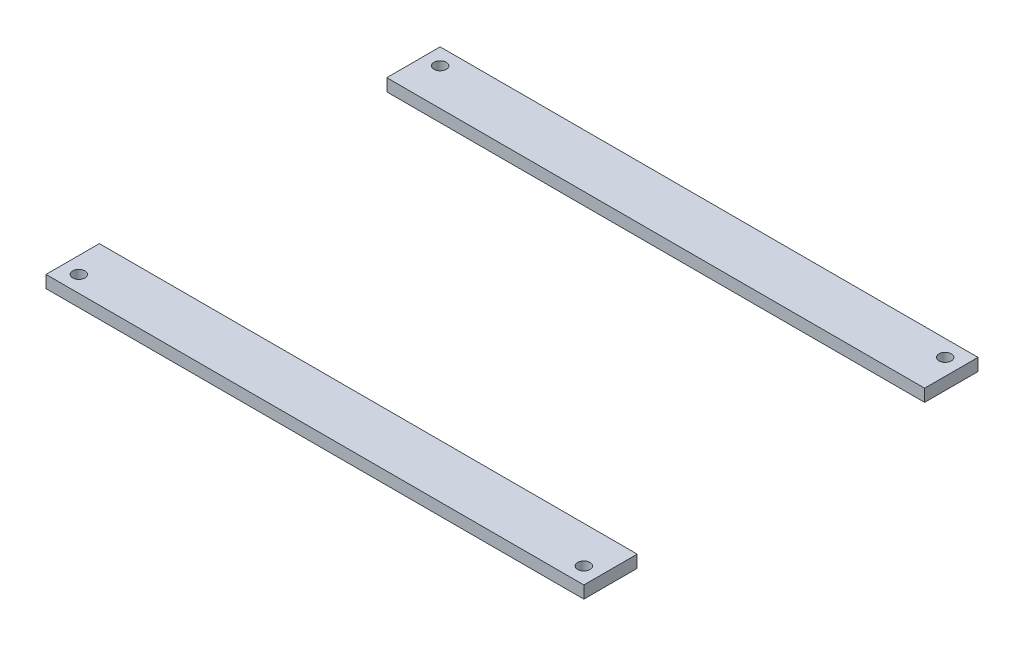
ISO-10303-21;
HEADER;
FILE_DESCRIPTION(('STEP AP214'),'2;1');
FILE_NAME('part.step','',(''),(''),'','','');
FILE_SCHEMA(('AUTOMOTIVE_DESIGN { 1 0 10303 214 1 1 1 1 }'));
ENDSEC;
DATA;
#1=APPLICATION_CONTEXT('core data for automotive mechanical design processes');
#2=APPLICATION_PROTOCOL_DEFINITION('international standard','automotive_design',2000,#1);
#3=PRODUCT_CONTEXT('',#1,'mechanical');
#4=PRODUCT('Part','Part','',(#3));
#5=PRODUCT_RELATED_PRODUCT_CATEGORY('part','',(#4));
#6=PRODUCT_DEFINITION_FORMATION('','',#4);
#7=PRODUCT_DEFINITION_CONTEXT('part definition',#1,'design');
#8=PRODUCT_DEFINITION('design','',#6,#7);
#9=PRODUCT_DEFINITION_SHAPE('','',#8);
#10=(LENGTH_UNIT() NAMED_UNIT(*) SI_UNIT(.MILLI.,.METRE.));
#11=(NAMED_UNIT(*) PLANE_ANGLE_UNIT() SI_UNIT($,.RADIAN.));
#12=(NAMED_UNIT(*) SI_UNIT($,.STERADIAN.) SOLID_ANGLE_UNIT());
#13=UNCERTAINTY_MEASURE_WITH_UNIT(LENGTH_MEASURE(1.E-05),#10,'distance_accuracy_value','');
#14=(GEOMETRIC_REPRESENTATION_CONTEXT(3) GLOBAL_UNCERTAINTY_ASSIGNED_CONTEXT((#13)) GLOBAL_UNIT_ASSIGNED_CONTEXT((#10,
#11,#12)) REPRESENTATION_CONTEXT('',''));
#15=CARTESIAN_POINT('',(0.,0.,0.));
#16=DIRECTION('',(0.,0.,1.));
#17=DIRECTION('',(1.,0.,0.));
#18=AXIS2_PLACEMENT_3D('',#15,#16,#17);
#19=CARTESIAN_POINT('',(-65.5,1.5,0.));
#20=DIRECTION('',(-1.,0.,0.));
#21=DIRECTION('',(0.,0.,1.));
#22=AXIS2_PLACEMENT_3D('',#19,#20,#21);
#23=PLANE('',#22);
#24=DIRECTION('',(0.,0.,-1.));
#25=VECTOR('',#24,1.);
#26=CARTESIAN_POINT('',(-65.5,-1.5,0.));
#27=LINE('',#26,#25);
#28=CARTESIAN_POINT('',(-65.5,-1.5,-35.));
#29=VERTEX_POINT('',#28);
#30=CARTESIAN_POINT('',(-65.5,-1.5,-48.));
#31=VERTEX_POINT('',#30);
#32=EDGE_CURVE('E127',#29,#31,#27,.T.);
#33=ORIENTED_EDGE('',*,*,#32,.F.);
#34=DIRECTION('',(0.,-1.,0.));
#35=VECTOR('',#34,1.);
#36=CARTESIAN_POINT('',(-65.5,1.5,-35.));
#37=LINE('',#36,#35);
#38=CARTESIAN_POINT('',(-65.5,1.5,-35.));
#39=VERTEX_POINT('',#38);
#40=EDGE_CURVE('E12',#39,#29,#37,.T.);
#41=ORIENTED_EDGE('',*,*,#40,.F.);
#42=DIRECTION('',(0.,0.,-1.));
#43=VECTOR('',#42,1.);
#44=CARTESIAN_POINT('',(-65.5,1.5,0.));
#45=LINE('',#44,#43);
#46=CARTESIAN_POINT('',(-65.5,1.5,-48.));
#47=VERTEX_POINT('',#46);
#48=EDGE_CURVE('E103',#39,#47,#45,.T.);
#49=ORIENTED_EDGE('',*,*,#48,.T.);
#50=DIRECTION('',(0.,-1.,0.));
#51=VECTOR('',#50,1.);
#52=CARTESIAN_POINT('',(-65.5,1.5,-48.));
#53=LINE('',#52,#51);
#54=EDGE_CURVE('E91',#47,#31,#53,.T.);
#55=ORIENTED_EDGE('',*,*,#54,.T.);
#56=EDGE_LOOP('',(#33,#41,#49,#55));
#57=FACE_BOUND('',#56,.T.);
#58=ADVANCED_FACE('F51',(#57),#23,.T.);
#59=CARTESIAN_POINT('',(0.,1.5,-35.));
#60=DIRECTION('',(0.,0.,-1.));
#61=DIRECTION('',(-1.,0.,0.));
#62=AXIS2_PLACEMENT_3D('',#59,#60,#61);
#63=PLANE('',#62);
#64=DIRECTION('',(1.,0.,0.));
#65=VECTOR('',#64,1.);
#66=CARTESIAN_POINT('',(0.,-1.5,-35.));
#67=LINE('',#66,#65);
#68=CARTESIAN_POINT('',(65.5,-1.5,-35.));
#69=VERTEX_POINT('',#68);
#70=EDGE_CURVE('E109',#29,#69,#67,.T.);
#71=ORIENTED_EDGE('',*,*,#70,.T.);
#72=DIRECTION('',(0.,-1.,0.));
#73=VECTOR('',#72,1.);
#74=CARTESIAN_POINT('',(65.5,1.5,-35.));
#75=LINE('',#74,#73);
#76=CARTESIAN_POINT('',(65.5,1.5,-35.));
#77=VERTEX_POINT('',#76);
#78=EDGE_CURVE('E60',#77,#69,#75,.T.);
#79=ORIENTED_EDGE('',*,*,#78,.F.);
#80=DIRECTION('',(1.,0.,0.));
#81=VECTOR('',#80,1.);
#82=CARTESIAN_POINT('',(0.,1.5,-35.));
#83=LINE('',#82,#81);
#84=EDGE_CURVE('E97',#39,#77,#83,.T.);
#85=ORIENTED_EDGE('',*,*,#84,.F.);
#86=ORIENTED_EDGE('',*,*,#40,.T.);
#87=EDGE_LOOP('',(#71,#79,#85,#86));
#88=FACE_BOUND('',#87,.T.);
#89=ADVANCED_FACE('F107',(#88),#63,.F.);
#90=CARTESIAN_POINT('',(65.5,1.5,0.));
#91=DIRECTION('',(-1.,0.,0.));
#92=DIRECTION('',(0.,0.,1.));
#93=AXIS2_PLACEMENT_3D('',#90,#91,#92);
#94=PLANE('',#93);
#95=DIRECTION('',(0.,0.,-1.));
#96=VECTOR('',#95,1.);
#97=CARTESIAN_POINT('',(65.5,-1.5,0.));
#98=LINE('',#97,#96);
#99=CARTESIAN_POINT('',(65.5,-1.5,-48.));
#100=VERTEX_POINT('',#99);
#101=EDGE_CURVE('E84',#69,#100,#98,.T.);
#102=ORIENTED_EDGE('',*,*,#101,.T.);
#103=DIRECTION('',(0.,-1.,0.));
#104=VECTOR('',#103,1.);
#105=CARTESIAN_POINT('',(65.5,1.5,-48.));
#106=LINE('',#105,#104);
#107=CARTESIAN_POINT('',(65.5,1.5,-48.));
#108=VERTEX_POINT('',#107);
#109=EDGE_CURVE('E111',#108,#100,#106,.T.);
#110=ORIENTED_EDGE('',*,*,#109,.F.);
#111=DIRECTION('',(0.,0.,-1.));
#112=VECTOR('',#111,1.);
#113=CARTESIAN_POINT('',(65.5,1.5,0.));
#114=LINE('',#113,#112);
#115=EDGE_CURVE('E102',#77,#108,#114,.T.);
#116=ORIENTED_EDGE('',*,*,#115,.F.);
#117=ORIENTED_EDGE('',*,*,#78,.T.);
#118=EDGE_LOOP('',(#102,#110,#116,#117));
#119=FACE_BOUND('',#118,.T.);
#120=ADVANCED_FACE('F112',(#119),#94,.F.);
#121=CARTESIAN_POINT('',(-61.5,1.5,-44.));
#122=DIRECTION('',(0.,-1.,0.));
#123=DIRECTION('',(0.,0.,-1.));
#124=AXIS2_PLACEMENT_3D('',#121,#122,#123);
#125=CYLINDRICAL_SURFACE('',#124,1.5);
#126=CARTESIAN_POINT('',(-61.5,1.5,-44.));
#127=DIRECTION('',(0.,1.,0.));
#128=DIRECTION('',(0.,0.,1.));
#129=AXIS2_PLACEMENT_3D('',#126,#127,#128);
#130=CIRCLE('',#129,1.5);
#131=CARTESIAN_POINT('',(-61.5,1.5,-42.5));
#132=VERTEX_POINT('',#131);
#133=EDGE_CURVE('E116',#132,#132,#130,.T.);
#134=ORIENTED_EDGE('',*,*,#133,.T.);
#135=EDGE_LOOP('',(#134));
#136=FACE_BOUND('',#135,.T.);
#137=CARTESIAN_POINT('',(-61.5,-1.5,-44.));
#138=DIRECTION('',(0.,1.,0.));
#139=DIRECTION('',(0.,0.,1.));
#140=AXIS2_PLACEMENT_3D('',#137,#138,#139);
#141=CIRCLE('',#140,1.5);
#142=CARTESIAN_POINT('',(-61.5,-1.5,-42.5));
#143=VERTEX_POINT('',#142);
#144=EDGE_CURVE('E138',#143,#143,#141,.T.);
#145=ORIENTED_EDGE('',*,*,#144,.F.);
#146=EDGE_LOOP('',(#145));
#147=FACE_BOUND('',#146,.T.);
#148=ADVANCED_FACE('F162',(#136,#147),#125,.F.);
#149=CARTESIAN_POINT('',(0.,1.5,-48.));
#150=DIRECTION('',(0.,0.,1.));
#151=DIRECTION('',(1.,0.,0.));
#152=AXIS2_PLACEMENT_3D('',#149,#150,#151);
#153=PLANE('',#152);
#154=DIRECTION('',(-1.,0.,0.));
#155=VECTOR('',#154,1.);
#156=CARTESIAN_POINT('',(0.,-1.5,-48.));
#157=LINE('',#156,#155);
#158=EDGE_CURVE('E135',#100,#31,#157,.T.);
#159=ORIENTED_EDGE('',*,*,#158,.T.);
#160=ORIENTED_EDGE('',*,*,#54,.F.);
#161=DIRECTION('',(-1.,0.,0.));
#162=VECTOR('',#161,1.);
#163=CARTESIAN_POINT('',(0.,1.5,-48.));
#164=LINE('',#163,#162);
#165=EDGE_CURVE('E68',#108,#47,#164,.T.);
#166=ORIENTED_EDGE('',*,*,#165,.F.);
#167=ORIENTED_EDGE('',*,*,#109,.T.);
#168=EDGE_LOOP('',(#159,#160,#166,#167));
#169=FACE_BOUND('',#168,.T.);
#170=ADVANCED_FACE('F151',(#169),#153,.F.);
#171=CARTESIAN_POINT('',(61.5,1.5,-44.));
#172=DIRECTION('',(0.,-1.,0.));
#173=DIRECTION('',(0.,0.,-1.));
#174=AXIS2_PLACEMENT_3D('',#171,#172,#173);
#175=CYLINDRICAL_SURFACE('',#174,1.5);
#176=CARTESIAN_POINT('',(61.5,1.5,-44.));
#177=DIRECTION('',(0.,1.,0.));
#178=DIRECTION('',(0.,0.,1.));
#179=AXIS2_PLACEMENT_3D('',#176,#177,#178);
#180=CIRCLE('',#179,1.5);
#181=CARTESIAN_POINT('',(61.5,1.5,-42.5));
#182=VERTEX_POINT('',#181);
#183=EDGE_CURVE('E123',#182,#182,#180,.F.);
#184=ORIENTED_EDGE('',*,*,#183,.F.);
#185=EDGE_LOOP('',(#184));
#186=FACE_BOUND('',#185,.T.);
#187=CARTESIAN_POINT('',(61.5,-1.5,-44.));
#188=DIRECTION('',(0.,1.,0.));
#189=DIRECTION('',(0.,0.,1.));
#190=AXIS2_PLACEMENT_3D('',#187,#188,#189);
#191=CIRCLE('',#190,1.5);
#192=CARTESIAN_POINT('',(61.5,-1.5,-42.5));
#193=VERTEX_POINT('',#192);
#194=EDGE_CURVE('E142',#193,#193,#191,.F.);
#195=ORIENTED_EDGE('',*,*,#194,.T.);
#196=EDGE_LOOP('',(#195));
#197=FACE_BOUND('',#196,.T.);
#198=ADVANCED_FACE('F167',(#186,#197),#175,.F.);
#199=CARTESIAN_POINT('',(0.,1.5,0.));
#200=DIRECTION('',(0.,1.,0.));
#201=DIRECTION('',(0.,0.,1.));
#202=AXIS2_PLACEMENT_3D('',#199,#200,#201);
#203=PLANE('',#202);
#204=ORIENTED_EDGE('',*,*,#48,.F.);
#205=ORIENTED_EDGE('',*,*,#84,.T.);
#206=ORIENTED_EDGE('',*,*,#115,.T.);
#207=ORIENTED_EDGE('',*,*,#165,.T.);
#208=EDGE_LOOP('',(#204,#205,#206,#207));
#209=FACE_BOUND('',#208,.T.);
#210=ORIENTED_EDGE('',*,*,#133,.F.);
#211=EDGE_LOOP('',(#210));
#212=FACE_BOUND('',#211,.T.);
#213=ORIENTED_EDGE('',*,*,#183,.T.);
#214=EDGE_LOOP('',(#213));
#215=FACE_BOUND('',#214,.T.);
#216=ADVANCED_FACE('F99',(#209,#212,#215),#203,.T.);
#217=CARTESIAN_POINT('',(0.,-1.5,0.));
#218=DIRECTION('',(0.,1.,0.));
#219=DIRECTION('',(0.,0.,1.));
#220=AXIS2_PLACEMENT_3D('',#217,#218,#219);
#221=PLANE('',#220);
#222=ORIENTED_EDGE('',*,*,#32,.T.);
#223=ORIENTED_EDGE('',*,*,#158,.F.);
#224=ORIENTED_EDGE('',*,*,#101,.F.);
#225=ORIENTED_EDGE('',*,*,#70,.F.);
#226=EDGE_LOOP('',(#222,#223,#224,#225));
#227=FACE_BOUND('',#226,.T.);
#228=ORIENTED_EDGE('',*,*,#144,.T.);
#229=EDGE_LOOP('',(#228));
#230=FACE_BOUND('',#229,.T.);
#231=ORIENTED_EDGE('',*,*,#194,.F.);
#232=EDGE_LOOP('',(#231));
#233=FACE_BOUND('',#232,.T.);
#234=ADVANCED_FACE('F153',(#227,#230,#233),#221,.F.);
#235=CLOSED_SHELL('',(#58,#89,#120,#148,#170,#198,#216,#234));
#236=MANIFOLD_SOLID_BREP('B2',#235);
#237=CARTESIAN_POINT('',(0.,1.5,35.));
#238=DIRECTION('',(0.,0.,-1.));
#239=DIRECTION('',(-1.,0.,0.));
#240=AXIS2_PLACEMENT_3D('',#237,#238,#239);
#241=PLANE('',#240);
#242=DIRECTION('',(1.,0.,0.));
#243=VECTOR('',#242,1.);
#244=CARTESIAN_POINT('',(0.,-1.5,35.));
#245=LINE('',#244,#243);
#246=CARTESIAN_POINT('',(-65.5,-1.5,35.));
#247=VERTEX_POINT('',#246);
#248=CARTESIAN_POINT('',(65.5,-1.5,35.));
#249=VERTEX_POINT('',#248);
#250=EDGE_CURVE('E304',#247,#249,#245,.T.);
#251=ORIENTED_EDGE('',*,*,#250,.F.);
#252=DIRECTION('',(0.,-1.,0.));
#253=VECTOR('',#252,1.);
#254=CARTESIAN_POINT('',(-65.5,1.5,35.));
#255=LINE('',#254,#253);
#256=CARTESIAN_POINT('',(-65.5,1.5,35.));
#257=VERTEX_POINT('',#256);
#258=EDGE_CURVE('E49',#257,#247,#255,.T.);
#259=ORIENTED_EDGE('',*,*,#258,.F.);
#260=DIRECTION('',(1.,0.,0.));
#261=VECTOR('',#260,1.);
#262=CARTESIAN_POINT('',(0.,1.5,35.));
#263=LINE('',#262,#261);
#264=CARTESIAN_POINT('',(65.5,1.5,35.));
#265=VERTEX_POINT('',#264);
#266=EDGE_CURVE('E291',#257,#265,#263,.T.);
#267=ORIENTED_EDGE('',*,*,#266,.T.);
#268=DIRECTION('',(0.,-1.,0.));
#269=VECTOR('',#268,1.);
#270=CARTESIAN_POINT('',(65.5,1.5,35.));
#271=LINE('',#270,#269);
#272=EDGE_CURVE('E272',#265,#249,#271,.T.);
#273=ORIENTED_EDGE('',*,*,#272,.T.);
#274=EDGE_LOOP('',(#251,#259,#267,#273));
#275=FACE_BOUND('',#274,.T.);
#276=ADVANCED_FACE('F233',(#275),#241,.T.);
#277=CARTESIAN_POINT('',(-65.5,1.5,0.));
#278=DIRECTION('',(-1.,0.,0.));
#279=DIRECTION('',(0.,0.,1.));
#280=AXIS2_PLACEMENT_3D('',#277,#278,#279);
#281=PLANE('',#280);
#282=DIRECTION('',(0.,0.,-1.));
#283=VECTOR('',#282,1.);
#284=CARTESIAN_POINT('',(-65.5,-1.5,0.));
#285=LINE('',#284,#283);
#286=CARTESIAN_POINT('',(-65.5,-1.5,48.));
#287=VERTEX_POINT('',#286);
#288=EDGE_CURVE('E283',#287,#247,#285,.T.);
#289=ORIENTED_EDGE('',*,*,#288,.F.);
#290=DIRECTION('',(0.,-1.,0.));
#291=VECTOR('',#290,1.);
#292=CARTESIAN_POINT('',(-65.5,1.5,48.));
#293=LINE('',#292,#291);
#294=CARTESIAN_POINT('',(-65.5,1.5,48.));
#295=VERTEX_POINT('',#294);
#296=EDGE_CURVE('E242',#295,#287,#293,.T.);
#297=ORIENTED_EDGE('',*,*,#296,.F.);
#298=DIRECTION('',(0.,0.,-1.));
#299=VECTOR('',#298,1.);
#300=CARTESIAN_POINT('',(-65.5,1.5,0.));
#301=LINE('',#300,#299);
#302=EDGE_CURVE('E281',#295,#257,#301,.T.);
#303=ORIENTED_EDGE('',*,*,#302,.T.);
#304=ORIENTED_EDGE('',*,*,#258,.T.);
#305=EDGE_LOOP('',(#289,#297,#303,#304));
#306=FACE_BOUND('',#305,.T.);
#307=ADVANCED_FACE('F280',(#306),#281,.T.);
#308=CARTESIAN_POINT('',(0.,1.5,48.));
#309=DIRECTION('',(0.,0.,1.));
#310=DIRECTION('',(1.,0.,0.));
#311=AXIS2_PLACEMENT_3D('',#308,#309,#310);
#312=PLANE('',#311);
#313=DIRECTION('',(-1.,0.,0.));
#314=VECTOR('',#313,1.);
#315=CARTESIAN_POINT('',(0.,-1.5,48.));
#316=LINE('',#315,#314);
#317=CARTESIAN_POINT('',(65.5,-1.5,48.));
#318=VERTEX_POINT('',#317);
#319=EDGE_CURVE('E308',#318,#287,#316,.T.);
#320=ORIENTED_EDGE('',*,*,#319,.F.);
#321=DIRECTION('',(0.,-1.,0.));
#322=VECTOR('',#321,1.);
#323=CARTESIAN_POINT('',(65.5,1.5,48.));
#324=LINE('',#323,#322);
#325=CARTESIAN_POINT('',(65.5,1.5,48.));
#326=VERTEX_POINT('',#325);
#327=EDGE_CURVE('E265',#326,#318,#324,.T.);
#328=ORIENTED_EDGE('',*,*,#327,.F.);
#329=DIRECTION('',(-1.,0.,0.));
#330=VECTOR('',#329,1.);
#331=CARTESIAN_POINT('',(0.,1.5,48.));
#332=LINE('',#331,#330);
#333=EDGE_CURVE('E290',#326,#295,#332,.T.);
#334=ORIENTED_EDGE('',*,*,#333,.T.);
#335=ORIENTED_EDGE('',*,*,#296,.T.);
#336=EDGE_LOOP('',(#320,#328,#334,#335));
#337=FACE_BOUND('',#336,.T.);
#338=ADVANCED_FACE('F293',(#337),#312,.T.);
#339=CARTESIAN_POINT('',(65.5,1.5,0.));
#340=DIRECTION('',(-1.,0.,0.));
#341=DIRECTION('',(0.,0.,1.));
#342=AXIS2_PLACEMENT_3D('',#339,#340,#341);
#343=PLANE('',#342);
#344=DIRECTION('',(0.,0.,-1.));
#345=VECTOR('',#344,1.);
#346=CARTESIAN_POINT('',(65.5,-1.5,0.));
#347=LINE('',#346,#345);
#348=EDGE_CURVE('E310',#318,#249,#347,.T.);
#349=ORIENTED_EDGE('',*,*,#348,.T.);
#350=ORIENTED_EDGE('',*,*,#272,.F.);
#351=DIRECTION('',(0.,0.,-1.));
#352=VECTOR('',#351,1.);
#353=CARTESIAN_POINT('',(65.5,1.5,0.));
#354=LINE('',#353,#352);
#355=EDGE_CURVE('E250',#326,#265,#354,.T.);
#356=ORIENTED_EDGE('',*,*,#355,.F.);
#357=ORIENTED_EDGE('',*,*,#327,.T.);
#358=EDGE_LOOP('',(#349,#350,#356,#357));
#359=FACE_BOUND('',#358,.T.);
#360=ADVANCED_FACE('F331',(#359),#343,.F.);
#361=CARTESIAN_POINT('',(61.5,1.5,44.));
#362=DIRECTION('',(0.,-1.,0.));
#363=DIRECTION('',(0.,0.,-1.));
#364=AXIS2_PLACEMENT_3D('',#361,#362,#363);
#365=CYLINDRICAL_SURFACE('',#364,1.5);
#366=CARTESIAN_POINT('',(61.5,1.5,44.));
#367=DIRECTION('',(0.,1.,0.));
#368=DIRECTION('',(0.,0.,1.));
#369=AXIS2_PLACEMENT_3D('',#366,#367,#368);
#370=CIRCLE('',#369,1.5);
#371=CARTESIAN_POINT('',(61.5,1.5,45.5));
#372=VERTEX_POINT('',#371);
#373=EDGE_CURVE('E315',#372,#372,#370,.T.);
#374=ORIENTED_EDGE('',*,*,#373,.T.);
#375=EDGE_LOOP('',(#374));
#376=FACE_BOUND('',#375,.T.);
#377=CARTESIAN_POINT('',(61.5,-1.5,44.));
#378=DIRECTION('',(0.,1.,0.));
#379=DIRECTION('',(0.,0.,1.));
#380=AXIS2_PLACEMENT_3D('',#377,#378,#379);
#381=CIRCLE('',#380,1.5);
#382=CARTESIAN_POINT('',(61.5,-1.5,45.5));
#383=VERTEX_POINT('',#382);
#384=EDGE_CURVE('E301',#383,#383,#381,.T.);
#385=ORIENTED_EDGE('',*,*,#384,.F.);
#386=EDGE_LOOP('',(#385));
#387=FACE_BOUND('',#386,.T.);
#388=ADVANCED_FACE('F235',(#376,#387),#365,.F.);
#389=CARTESIAN_POINT('',(-61.5,1.5,44.));
#390=DIRECTION('',(0.,-1.,0.));
#391=DIRECTION('',(0.,0.,-1.));
#392=AXIS2_PLACEMENT_3D('',#389,#390,#391);
#393=CYLINDRICAL_SURFACE('',#392,1.5);
#394=CARTESIAN_POINT('',(-61.5,1.5,44.));
#395=DIRECTION('',(0.,1.,0.));
#396=DIRECTION('',(0.,0.,1.));
#397=AXIS2_PLACEMENT_3D('',#394,#395,#396);
#398=CIRCLE('',#397,1.5);
#399=CARTESIAN_POINT('',(-61.5,1.5,45.5));
#400=VERTEX_POINT('',#399);
#401=EDGE_CURVE('E295',#400,#400,#398,.F.);
#402=ORIENTED_EDGE('',*,*,#401,.F.);
#403=EDGE_LOOP('',(#402));
#404=FACE_BOUND('',#403,.T.);
#405=CARTESIAN_POINT('',(-61.5,-1.5,44.));
#406=DIRECTION('',(0.,1.,0.));
#407=DIRECTION('',(0.,0.,1.));
#408=AXIS2_PLACEMENT_3D('',#405,#406,#407);
#409=CIRCLE('',#408,1.5);
#410=CARTESIAN_POINT('',(-61.5,-1.5,45.5));
#411=VERTEX_POINT('',#410);
#412=EDGE_CURVE('E312',#411,#411,#409,.F.);
#413=ORIENTED_EDGE('',*,*,#412,.T.);
#414=EDGE_LOOP('',(#413));
#415=FACE_BOUND('',#414,.T.);
#416=ADVANCED_FACE('F334',(#404,#415),#393,.F.);
#417=CARTESIAN_POINT('',(0.,1.5,0.));
#418=DIRECTION('',(0.,1.,0.));
#419=DIRECTION('',(0.,0.,1.));
#420=AXIS2_PLACEMENT_3D('',#417,#418,#419);
#421=PLANE('',#420);
#422=ORIENTED_EDGE('',*,*,#373,.F.);
#423=EDGE_LOOP('',(#422));
#424=FACE_BOUND('',#423,.T.);
#425=ORIENTED_EDGE('',*,*,#266,.F.);
#426=ORIENTED_EDGE('',*,*,#302,.F.);
#427=ORIENTED_EDGE('',*,*,#333,.F.);
#428=ORIENTED_EDGE('',*,*,#355,.T.);
#429=EDGE_LOOP('',(#425,#426,#427,#428));
#430=FACE_BOUND('',#429,.T.);
#431=ORIENTED_EDGE('',*,*,#401,.T.);
#432=EDGE_LOOP('',(#431));
#433=FACE_BOUND('',#432,.T.);
#434=ADVANCED_FACE('F288',(#424,#430,#433),#421,.T.);
#435=CARTESIAN_POINT('',(0.,-1.5,0.));
#436=DIRECTION('',(0.,1.,0.));
#437=DIRECTION('',(0.,0.,1.));
#438=AXIS2_PLACEMENT_3D('',#435,#436,#437);
#439=PLANE('',#438);
#440=ORIENTED_EDGE('',*,*,#384,.T.);
#441=EDGE_LOOP('',(#440));
#442=FACE_BOUND('',#441,.T.);
#443=ORIENTED_EDGE('',*,*,#250,.T.);
#444=ORIENTED_EDGE('',*,*,#348,.F.);
#445=ORIENTED_EDGE('',*,*,#319,.T.);
#446=ORIENTED_EDGE('',*,*,#288,.T.);
#447=EDGE_LOOP('',(#443,#444,#445,#446));
#448=FACE_BOUND('',#447,.T.);
#449=ORIENTED_EDGE('',*,*,#412,.F.);
#450=EDGE_LOOP('',(#449));
#451=FACE_BOUND('',#450,.T.);
#452=ADVANCED_FACE('F338',(#442,#448,#451),#439,.F.);
#453=CLOSED_SHELL('',(#276,#307,#338,#360,#388,#416,#434,#452));
#454=MANIFOLD_SOLID_BREP('B6',#453);
#455=ADVANCED_BREP_SHAPE_REPRESENTATION('',(#18,#236,#454),#14);
#456=SHAPE_DEFINITION_REPRESENTATION(#9,#455);
ENDSEC;
END-ISO-10303-21;
